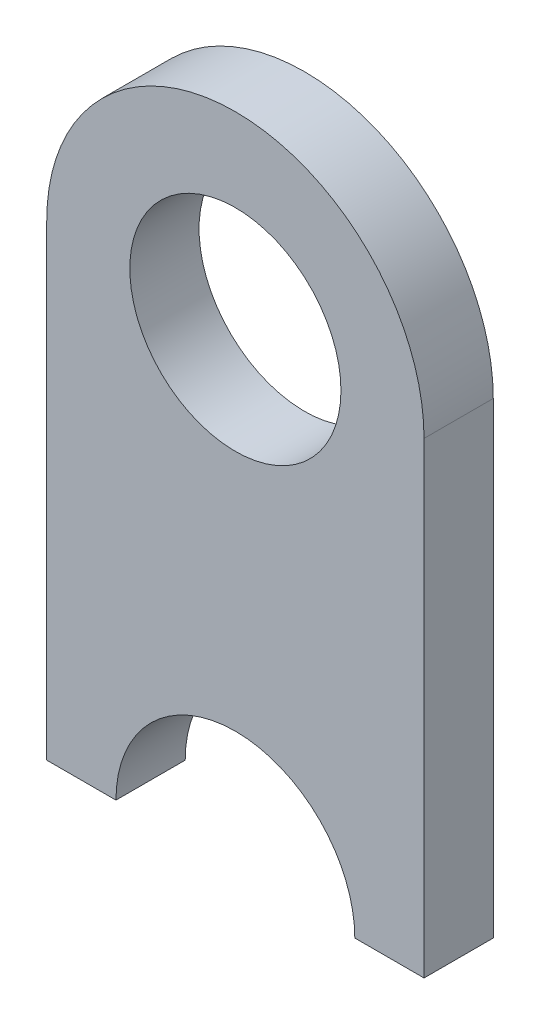
ISO-10303-21;
HEADER;
FILE_DESCRIPTION(('STEP AP214'),'2;1');
FILE_NAME('part.step','',(''),(''),'','','');
FILE_SCHEMA(('AUTOMOTIVE_DESIGN { 1 0 10303 214 1 1 1 1 }'));
ENDSEC;
DATA;
#1=APPLICATION_CONTEXT('core data for automotive mechanical design processes');
#2=APPLICATION_PROTOCOL_DEFINITION('international standard','automotive_design',2000,#1);
#3=PRODUCT_CONTEXT('',#1,'mechanical');
#4=PRODUCT('Part','Part','',(#3));
#5=PRODUCT_RELATED_PRODUCT_CATEGORY('part','',(#4));
#6=PRODUCT_DEFINITION_FORMATION('','',#4);
#7=PRODUCT_DEFINITION_CONTEXT('part definition',#1,'design');
#8=PRODUCT_DEFINITION('design','',#6,#7);
#9=PRODUCT_DEFINITION_SHAPE('','',#8);
#10=(LENGTH_UNIT() NAMED_UNIT(*) SI_UNIT(.MILLI.,.METRE.));
#11=(NAMED_UNIT(*) PLANE_ANGLE_UNIT() SI_UNIT($,.RADIAN.));
#12=(NAMED_UNIT(*) SI_UNIT($,.STERADIAN.) SOLID_ANGLE_UNIT());
#13=UNCERTAINTY_MEASURE_WITH_UNIT(LENGTH_MEASURE(1.E-05),#10,'distance_accuracy_value','');
#14=(GEOMETRIC_REPRESENTATION_CONTEXT(3) GLOBAL_UNCERTAINTY_ASSIGNED_CONTEXT((#13)) GLOBAL_UNIT_ASSIGNED_CONTEXT((#10,
#11,#12)) REPRESENTATION_CONTEXT('',''));
#15=CARTESIAN_POINT('',(0.,0.,0.));
#16=DIRECTION('',(0.,0.,1.));
#17=DIRECTION('',(1.,0.,0.));
#18=AXIS2_PLACEMENT_3D('',#15,#16,#17);
#19=CARTESIAN_POINT('',(0.,20.3339891731331,4.));
#20=DIRECTION('',(0.,0.,1.));
#21=DIRECTION('',(1.,0.,0.));
#22=AXIS2_PLACEMENT_3D('',#19,#20,#21);
#23=PLANE('',#22);
#24=CARTESIAN_POINT('',(0.,20.3339891731331,4.));
#25=DIRECTION('',(0.,0.,1.));
#26=DIRECTION('',(1.,0.,0.));
#27=AXIS2_PLACEMENT_3D('',#24,#25,#26);
#28=CIRCLE('',#27,10.9);
#29=CARTESIAN_POINT('',(10.9,20.3339891731331,4.));
#30=VERTEX_POINT('',#29);
#31=CARTESIAN_POINT('',(-10.9,20.3339891731331,4.));
#32=VERTEX_POINT('',#31);
#33=EDGE_CURVE('E130',#30,#32,#28,.T.);
#34=ORIENTED_EDGE('',*,*,#33,.T.);
#35=DIRECTION('',(0.,-1.,0.));
#36=VECTOR('',#35,1.);
#37=CARTESIAN_POINT('',(-10.9,20.3339891731331,4.));
#38=LINE('',#37,#36);
#39=CARTESIAN_POINT('',(-10.9,-6.66601082686693,4.));
#40=VERTEX_POINT('',#39);
#41=EDGE_CURVE('E86',#32,#40,#38,.T.);
#42=ORIENTED_EDGE('',*,*,#41,.T.);
#43=DIRECTION('',(1.,0.,0.));
#44=VECTOR('',#43,1.);
#45=CARTESIAN_POINT('',(-10.9,-6.66601082686693,4.));
#46=LINE('',#45,#44);
#47=CARTESIAN_POINT('',(-6.9,-6.66601082686693,4.));
#48=VERTEX_POINT('',#47);
#49=EDGE_CURVE('E99',#40,#48,#46,.T.);
#50=ORIENTED_EDGE('',*,*,#49,.T.);
#51=CARTESIAN_POINT('',(0.,-6.66601082686693,4.));
#52=DIRECTION('',(0.,0.,-1.));
#53=DIRECTION('',(1.,0.,0.));
#54=AXIS2_PLACEMENT_3D('',#51,#52,#53);
#55=CIRCLE('',#54,6.9);
#56=CARTESIAN_POINT('',(6.9,-6.66601082686693,4.));
#57=VERTEX_POINT('',#56);
#58=EDGE_CURVE('E93',#48,#57,#55,.T.);
#59=ORIENTED_EDGE('',*,*,#58,.T.);
#60=DIRECTION('',(1.,0.,0.));
#61=VECTOR('',#60,1.);
#62=CARTESIAN_POINT('',(6.9,-6.66601082686693,4.));
#63=LINE('',#62,#61);
#64=CARTESIAN_POINT('',(10.9,-6.66601082686693,4.));
#65=VERTEX_POINT('',#64);
#66=EDGE_CURVE('E97',#57,#65,#63,.T.);
#67=ORIENTED_EDGE('',*,*,#66,.T.);
#68=DIRECTION('',(0.,1.,0.));
#69=VECTOR('',#68,1.);
#70=CARTESIAN_POINT('',(10.9,20.3339891731331,4.));
#71=LINE('',#70,#69);
#72=EDGE_CURVE('E50',#65,#30,#71,.T.);
#73=ORIENTED_EDGE('',*,*,#72,.T.);
#74=EDGE_LOOP('',(#34,#42,#50,#59,#67,#73));
#75=FACE_BOUND('',#74,.T.);
#76=CARTESIAN_POINT('',(0.,20.3339891731331,4.));
#77=DIRECTION('',(0.,0.,1.));
#78=DIRECTION('',(1.,0.,0.));
#79=AXIS2_PLACEMENT_3D('',#76,#77,#78);
#80=CIRCLE('',#79,6.1);
#81=CARTESIAN_POINT('',(6.1,20.3339891731331,4.));
#82=VERTEX_POINT('',#81);
#83=EDGE_CURVE('E122',#82,#82,#80,.T.);
#84=ORIENTED_EDGE('',*,*,#83,.F.);
#85=EDGE_LOOP('',(#84));
#86=FACE_BOUND('',#85,.T.);
#87=ADVANCED_FACE('F33',(#75,#86),#23,.T.);
#88=CARTESIAN_POINT('',(0.,20.3339891731331,0.));
#89=DIRECTION('',(0.,0.,1.));
#90=DIRECTION('',(1.,0.,0.));
#91=AXIS2_PLACEMENT_3D('',#88,#89,#90);
#92=PLANE('',#91);
#93=CARTESIAN_POINT('',(0.,20.3339891731331,0.));
#94=DIRECTION('',(0.,0.,1.));
#95=DIRECTION('',(1.,0.,0.));
#96=AXIS2_PLACEMENT_3D('',#93,#94,#95);
#97=CIRCLE('',#96,10.9);
#98=CARTESIAN_POINT('',(10.9,20.3339891731331,0.));
#99=VERTEX_POINT('',#98);
#100=CARTESIAN_POINT('',(-10.9,20.3339891731331,0.));
#101=VERTEX_POINT('',#100);
#102=EDGE_CURVE('E118',#99,#101,#97,.T.);
#103=ORIENTED_EDGE('',*,*,#102,.F.);
#104=DIRECTION('',(0.,1.,0.));
#105=VECTOR('',#104,1.);
#106=CARTESIAN_POINT('',(10.9,20.3339891731331,0.));
#107=LINE('',#106,#105);
#108=CARTESIAN_POINT('',(10.9,-6.66601082686693,0.));
#109=VERTEX_POINT('',#108);
#110=EDGE_CURVE('E78',#109,#99,#107,.T.);
#111=ORIENTED_EDGE('',*,*,#110,.F.);
#112=DIRECTION('',(1.,0.,0.));
#113=VECTOR('',#112,1.);
#114=CARTESIAN_POINT('',(8.65,-6.66601082686693,0.));
#115=LINE('',#114,#113);
#116=CARTESIAN_POINT('',(6.9,-6.66601082686693,0.));
#117=VERTEX_POINT('',#116);
#118=EDGE_CURVE('E72',#117,#109,#115,.T.);
#119=ORIENTED_EDGE('',*,*,#118,.F.);
#120=CARTESIAN_POINT('',(0.,-6.66601082686693,0.));
#121=DIRECTION('',(0.,0.,-1.));
#122=DIRECTION('',(1.,0.,0.));
#123=AXIS2_PLACEMENT_3D('',#120,#121,#122);
#124=CIRCLE('',#123,6.9);
#125=CARTESIAN_POINT('',(-6.9,-6.66601082686693,0.));
#126=VERTEX_POINT('',#125);
#127=EDGE_CURVE('E108',#126,#117,#124,.T.);
#128=ORIENTED_EDGE('',*,*,#127,.F.);
#129=DIRECTION('',(1.,0.,0.));
#130=VECTOR('',#129,1.);
#131=CARTESIAN_POINT('',(-8.65,-6.66601082686693,0.));
#132=LINE('',#131,#130);
#133=CARTESIAN_POINT('',(-10.9,-6.66601082686693,0.));
#134=VERTEX_POINT('',#133);
#135=EDGE_CURVE('E125',#134,#126,#132,.T.);
#136=ORIENTED_EDGE('',*,*,#135,.F.);
#137=DIRECTION('',(0.,-1.,0.));
#138=VECTOR('',#137,1.);
#139=CARTESIAN_POINT('',(-10.9,20.3339891731331,0.));
#140=LINE('',#139,#138);
#141=EDGE_CURVE('E121',#101,#134,#140,.T.);
#142=ORIENTED_EDGE('',*,*,#141,.F.);
#143=EDGE_LOOP('',(#103,#111,#119,#128,#136,#142));
#144=FACE_BOUND('',#143,.T.);
#145=CARTESIAN_POINT('',(0.,20.3339891731331,0.));
#146=DIRECTION('',(0.,0.,1.));
#147=DIRECTION('',(1.,0.,0.));
#148=AXIS2_PLACEMENT_3D('',#145,#146,#147);
#149=CIRCLE('',#148,6.1);
#150=CARTESIAN_POINT('',(6.1,20.3339891731331,0.));
#151=VERTEX_POINT('',#150);
#152=EDGE_CURVE('E228',#151,#151,#149,.T.);
#153=ORIENTED_EDGE('',*,*,#152,.T.);
#154=EDGE_LOOP('',(#153));
#155=FACE_BOUND('',#154,.T.);
#156=ADVANCED_FACE('F140',(#144,#155),#92,.F.);
#157=CARTESIAN_POINT('',(0.,20.3339891731331,4.));
#158=DIRECTION('',(0.,0.,-1.));
#159=DIRECTION('',(-1.,0.,0.));
#160=AXIS2_PLACEMENT_3D('',#157,#158,#159);
#161=CYLINDRICAL_SURFACE('',#160,10.9);
#162=ORIENTED_EDGE('',*,*,#102,.T.);
#163=DIRECTION('',(0.,0.,-1.));
#164=VECTOR('',#163,1.);
#165=CARTESIAN_POINT('',(-10.9,20.3339891731331,4.));
#166=LINE('',#165,#164);
#167=EDGE_CURVE('E11',#32,#101,#166,.T.);
#168=ORIENTED_EDGE('',*,*,#167,.F.);
#169=ORIENTED_EDGE('',*,*,#33,.F.);
#170=DIRECTION('',(0.,0.,-1.));
#171=VECTOR('',#170,1.);
#172=CARTESIAN_POINT('',(10.9,20.3339891731331,4.));
#173=LINE('',#172,#171);
#174=EDGE_CURVE('E114',#30,#99,#173,.T.);
#175=ORIENTED_EDGE('',*,*,#174,.T.);
#176=EDGE_LOOP('',(#162,#168,#169,#175));
#177=FACE_BOUND('',#176,.T.);
#178=ADVANCED_FACE('F35',(#177),#161,.T.);
#179=CARTESIAN_POINT('',(-10.9,20.3339891731331,4.));
#180=DIRECTION('',(1.,0.,0.));
#181=DIRECTION('',(0.,0.,-1.));
#182=AXIS2_PLACEMENT_3D('',#179,#180,#181);
#183=PLANE('',#182);
#184=ORIENTED_EDGE('',*,*,#141,.T.);
#185=DIRECTION('',(0.,0.,-1.));
#186=VECTOR('',#185,1.);
#187=CARTESIAN_POINT('',(-10.9,-6.66601082686693,4.));
#188=LINE('',#187,#186);
#189=EDGE_CURVE('E42',#40,#134,#188,.T.);
#190=ORIENTED_EDGE('',*,*,#189,.F.);
#191=ORIENTED_EDGE('',*,*,#41,.F.);
#192=ORIENTED_EDGE('',*,*,#167,.T.);
#193=EDGE_LOOP('',(#184,#190,#191,#192));
#194=FACE_BOUND('',#193,.T.);
#195=ADVANCED_FACE('F136',(#194),#183,.F.);
#196=CARTESIAN_POINT('',(-8.65,-6.66601082686693,4.));
#197=DIRECTION('',(0.,1.,0.));
#198=DIRECTION('',(0.,0.,1.));
#199=AXIS2_PLACEMENT_3D('',#196,#197,#198);
#200=PLANE('',#199);
#201=ORIENTED_EDGE('',*,*,#135,.T.);
#202=DIRECTION('',(0.,0.,-1.));
#203=VECTOR('',#202,1.);
#204=CARTESIAN_POINT('',(-6.9,-6.66601082686693,4.));
#205=LINE('',#204,#203);
#206=EDGE_CURVE('E109',#48,#126,#205,.T.);
#207=ORIENTED_EDGE('',*,*,#206,.F.);
#208=ORIENTED_EDGE('',*,*,#49,.F.);
#209=ORIENTED_EDGE('',*,*,#189,.T.);
#210=EDGE_LOOP('',(#201,#207,#208,#209));
#211=FACE_BOUND('',#210,.T.);
#212=ADVANCED_FACE('F135',(#211),#200,.F.);
#213=CARTESIAN_POINT('',(0.,-6.66601082686693,4.));
#214=DIRECTION('',(0.,0.,-1.));
#215=DIRECTION('',(-1.,0.,0.));
#216=AXIS2_PLACEMENT_3D('',#213,#214,#215);
#217=CYLINDRICAL_SURFACE('',#216,6.9);
#218=ORIENTED_EDGE('',*,*,#127,.T.);
#219=DIRECTION('',(0.,0.,-1.));
#220=VECTOR('',#219,1.);
#221=CARTESIAN_POINT('',(6.9,-6.66601082686693,4.));
#222=LINE('',#221,#220);
#223=EDGE_CURVE('E105',#57,#117,#222,.T.);
#224=ORIENTED_EDGE('',*,*,#223,.F.);
#225=ORIENTED_EDGE('',*,*,#58,.F.);
#226=ORIENTED_EDGE('',*,*,#206,.T.);
#227=EDGE_LOOP('',(#218,#224,#225,#226));
#228=FACE_BOUND('',#227,.T.);
#229=ADVANCED_FACE('F106',(#228),#217,.F.);
#230=CARTESIAN_POINT('',(8.65,-6.66601082686693,4.));
#231=DIRECTION('',(0.,1.,0.));
#232=DIRECTION('',(0.,0.,1.));
#233=AXIS2_PLACEMENT_3D('',#230,#231,#232);
#234=PLANE('',#233);
#235=ORIENTED_EDGE('',*,*,#118,.T.);
#236=DIRECTION('',(0.,0.,-1.));
#237=VECTOR('',#236,1.);
#238=CARTESIAN_POINT('',(10.9,-6.66601082686693,4.));
#239=LINE('',#238,#237);
#240=EDGE_CURVE('E110',#65,#109,#239,.T.);
#241=ORIENTED_EDGE('',*,*,#240,.F.);
#242=ORIENTED_EDGE('',*,*,#66,.F.);
#243=ORIENTED_EDGE('',*,*,#223,.T.);
#244=EDGE_LOOP('',(#235,#241,#242,#243));
#245=FACE_BOUND('',#244,.T.);
#246=ADVANCED_FACE('F112',(#245),#234,.F.);
#247=CARTESIAN_POINT('',(10.9,20.3339891731331,4.));
#248=DIRECTION('',(-1.,0.,0.));
#249=DIRECTION('',(0.,-1.,0.));
#250=AXIS2_PLACEMENT_3D('',#247,#248,#249);
#251=PLANE('',#250);
#252=ORIENTED_EDGE('',*,*,#110,.T.);
#253=ORIENTED_EDGE('',*,*,#174,.F.);
#254=ORIENTED_EDGE('',*,*,#72,.F.);
#255=ORIENTED_EDGE('',*,*,#240,.T.);
#256=EDGE_LOOP('',(#252,#253,#254,#255));
#257=FACE_BOUND('',#256,.T.);
#258=ADVANCED_FACE('F144',(#257),#251,.F.);
#259=CARTESIAN_POINT('',(0.,20.3339891731331,4.));
#260=DIRECTION('',(0.,0.,-1.));
#261=DIRECTION('',(-1.,0.,0.));
#262=AXIS2_PLACEMENT_3D('',#259,#260,#261);
#263=CYLINDRICAL_SURFACE('',#262,6.1);
#264=ORIENTED_EDGE('',*,*,#83,.T.);
#265=EDGE_LOOP('',(#264));
#266=FACE_BOUND('',#265,.T.);
#267=ORIENTED_EDGE('',*,*,#152,.F.);
#268=EDGE_LOOP('',(#267));
#269=FACE_BOUND('',#268,.T.);
#270=ADVANCED_FACE('F146',(#266,#269),#263,.F.);
#271=CLOSED_SHELL('',(#87,#156,#178,#195,#212,#229,#246,#258,#270));
#272=MANIFOLD_SOLID_BREP('B2',#271);
#273=ADVANCED_BREP_SHAPE_REPRESENTATION('',(#18,#272),#14);
#274=SHAPE_DEFINITION_REPRESENTATION(#9,#273);
ENDSEC;
END-ISO-10303-21;
